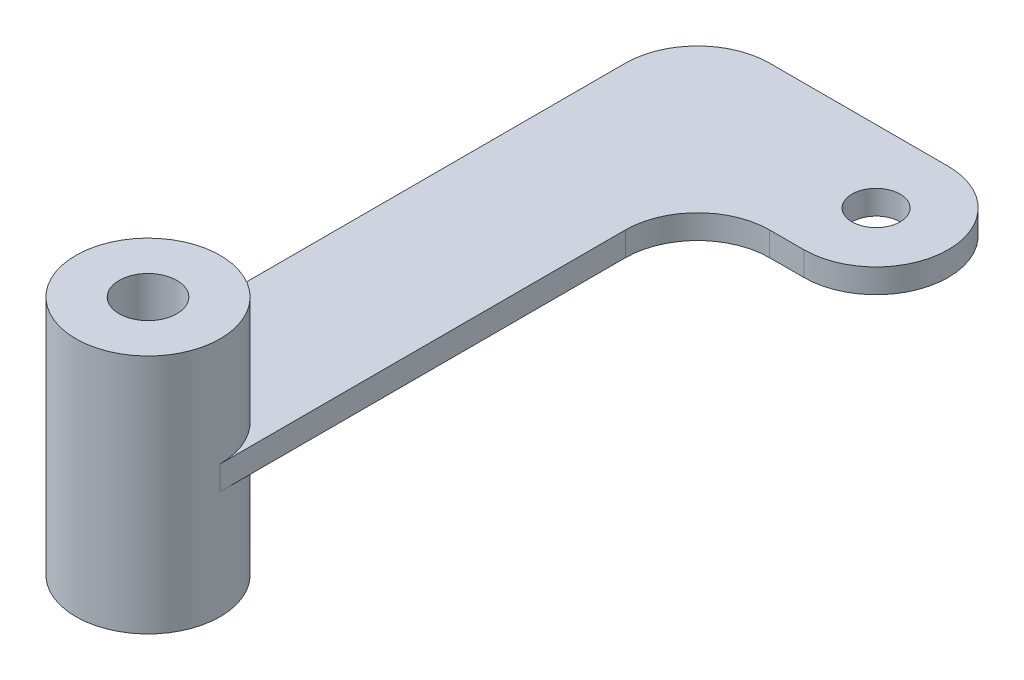
ISO-10303-21;
HEADER;
FILE_DESCRIPTION(('STEP AP214'),'2;1');
FILE_NAME('part.step','',(''),(''),'','','');
FILE_SCHEMA(('AUTOMOTIVE_DESIGN { 1 0 10303 214 1 1 1 1 }'));
ENDSEC;
DATA;
#1=APPLICATION_CONTEXT('core data for automotive mechanical design processes');
#2=APPLICATION_PROTOCOL_DEFINITION('international standard','automotive_design',2000,#1);
#3=PRODUCT_CONTEXT('',#1,'mechanical');
#4=PRODUCT('Part','Part','',(#3));
#5=PRODUCT_RELATED_PRODUCT_CATEGORY('part','',(#4));
#6=PRODUCT_DEFINITION_FORMATION('','',#4);
#7=PRODUCT_DEFINITION_CONTEXT('part definition',#1,'design');
#8=PRODUCT_DEFINITION('design','',#6,#7);
#9=PRODUCT_DEFINITION_SHAPE('','',#8);
#10=(LENGTH_UNIT() NAMED_UNIT(*) SI_UNIT(.MILLI.,.METRE.));
#11=(NAMED_UNIT(*) PLANE_ANGLE_UNIT() SI_UNIT($,.RADIAN.));
#12=(NAMED_UNIT(*) SI_UNIT($,.STERADIAN.) SOLID_ANGLE_UNIT());
#13=UNCERTAINTY_MEASURE_WITH_UNIT(LENGTH_MEASURE(1.E-05),#10,'distance_accuracy_value','');
#14=(GEOMETRIC_REPRESENTATION_CONTEXT(3) GLOBAL_UNCERTAINTY_ASSIGNED_CONTEXT((#13)) GLOBAL_UNIT_ASSIGNED_CONTEXT((#10,
#11,#12)) REPRESENTATION_CONTEXT('',''));
#15=CARTESIAN_POINT('',(0.,0.,0.));
#16=DIRECTION('',(0.,0.,1.));
#17=DIRECTION('',(1.,0.,0.));
#18=AXIS2_PLACEMENT_3D('',#15,#16,#17);
#19=CARTESIAN_POINT('',(6.,-5.,0.));
#20=DIRECTION('',(0.,1.,0.));
#21=DIRECTION('',(0.,0.,1.));
#22=AXIS2_PLACEMENT_3D('',#19,#20,#21);
#23=PLANE('',#22);
#24=CARTESIAN_POINT('',(0.,-5.,0.));
#25=DIRECTION('',(0.,1.,0.));
#26=DIRECTION('',(0.,0.,1.));
#27=AXIS2_PLACEMENT_3D('',#24,#25,#26);
#28=CIRCLE('',#27,5.99999999999999);
#29=CARTESIAN_POINT('',(0.,-5.,5.99999999999999));
#30=VERTEX_POINT('',#29);
#31=EDGE_CURVE('E162',#30,#30,#28,.T.);
#32=ORIENTED_EDGE('',*,*,#31,.F.);
#33=EDGE_LOOP('',(#32));
#34=FACE_BOUND('',#33,.T.);
#35=CARTESIAN_POINT('',(0.,-5.,0.));
#36=DIRECTION('',(0.,1.,0.));
#37=DIRECTION('',(0.,0.,1.));
#38=AXIS2_PLACEMENT_3D('',#35,#36,#37);
#39=CIRCLE('',#38,4.99999999999999);
#40=CARTESIAN_POINT('',(0.,-5.,4.99999999999999));
#41=VERTEX_POINT('',#40);
#42=EDGE_CURVE('E136',#41,#41,#39,.T.);
#43=ORIENTED_EDGE('',*,*,#42,.T.);
#44=EDGE_LOOP('',(#43));
#45=FACE_BOUND('',#44,.T.);
#46=ADVANCED_FACE('F41',(#34,#45),#23,.F.);
#47=CARTESIAN_POINT('',(0.,25.,0.));
#48=DIRECTION('',(0.,1.,0.));
#49=DIRECTION('',(0.,0.,1.));
#50=AXIS2_PLACEMENT_3D('',#47,#48,#49);
#51=CYLINDRICAL_SURFACE('',#50,5.99999999999999);
#52=CARTESIAN_POINT('',(0.,-25.,0.));
#53=DIRECTION('',(0.,1.,0.));
#54=DIRECTION('',(0.,0.,1.));
#55=AXIS2_PLACEMENT_3D('',#52,#53,#54);
#56=CIRCLE('',#55,5.99999999999999);
#57=CARTESIAN_POINT('',(0.,-25.,5.99999999999999));
#58=VERTEX_POINT('',#57);
#59=EDGE_CURVE('E159',#58,#58,#56,.T.);
#60=ORIENTED_EDGE('',*,*,#59,.F.);
#61=EDGE_LOOP('',(#60));
#62=FACE_BOUND('',#61,.T.);
#63=ORIENTED_EDGE('',*,*,#31,.T.);
#64=EDGE_LOOP('',(#63));
#65=FACE_BOUND('',#64,.T.);
#66=ADVANCED_FACE('F196',(#62,#65),#51,.F.);
#67=CARTESIAN_POINT('',(15.,-25.,0.));
#68=DIRECTION('',(0.,1.,0.));
#69=DIRECTION('',(0.,0.,1.));
#70=AXIS2_PLACEMENT_3D('',#67,#68,#69);
#71=PLANE('',#70);
#72=CARTESIAN_POINT('',(0.,-25.,0.));
#73=DIRECTION('',(0.,1.,0.));
#74=DIRECTION('',(0.,0.,1.));
#75=AXIS2_PLACEMENT_3D('',#72,#73,#74);
#76=CIRCLE('',#75,15.);
#77=CARTESIAN_POINT('',(0.,-25.,15.));
#78=VERTEX_POINT('',#77);
#79=EDGE_CURVE('E156',#78,#78,#76,.T.);
#80=ORIENTED_EDGE('',*,*,#79,.F.);
#81=EDGE_LOOP('',(#80));
#82=FACE_BOUND('',#81,.T.);
#83=ORIENTED_EDGE('',*,*,#59,.T.);
#84=EDGE_LOOP('',(#83));
#85=FACE_BOUND('',#84,.T.);
#86=ADVANCED_FACE('F202',(#82,#85),#71,.F.);
#87=CARTESIAN_POINT('',(0.,25.,0.));
#88=DIRECTION('',(0.,1.,0.));
#89=DIRECTION('',(0.,0.,1.));
#90=AXIS2_PLACEMENT_3D('',#87,#88,#89);
#91=CYLINDRICAL_SURFACE('',#90,15.);
#92=DIRECTION('',(0.,-1.,0.));
#93=VECTOR('',#92,1.);
#94=CARTESIAN_POINT('',(15.,2.5,0.));
#95=LINE('',#94,#93);
#96=CARTESIAN_POINT('',(15.,2.5,0.));
#97=VERTEX_POINT('',#96);
#98=CARTESIAN_POINT('',(15.,-2.5,0.));
#99=VERTEX_POINT('',#98);
#100=EDGE_CURVE('E186',#97,#99,#95,.T.);
#101=ORIENTED_EDGE('',*,*,#100,.F.);
#102=CARTESIAN_POINT('',(0.,2.5,0.));
#103=DIRECTION('',(0.,1.,0.));
#104=DIRECTION('',(0.,0.,1.));
#105=AXIS2_PLACEMENT_3D('',#102,#103,#104);
#106=CIRCLE('',#105,15.);
#107=CARTESIAN_POINT('',(-8.29156197588848,2.5,-12.5));
#108=VERTEX_POINT('',#107);
#109=EDGE_CURVE('E399',#97,#108,#106,.T.);
#110=ORIENTED_EDGE('',*,*,#109,.T.);
#111=DIRECTION('',(0.,-1.,0.));
#112=VECTOR('',#111,1.);
#113=CARTESIAN_POINT('',(-8.29156197588848,2.5,-12.5));
#114=LINE('',#113,#112);
#115=CARTESIAN_POINT('',(-8.29156197588848,-2.5,-12.5));
#116=VERTEX_POINT('',#115);
#117=EDGE_CURVE('E376',#108,#116,#114,.T.);
#118=ORIENTED_EDGE('',*,*,#117,.T.);
#119=CARTESIAN_POINT('',(0.,-2.5,0.));
#120=DIRECTION('',(0.,1.,0.));
#121=DIRECTION('',(0.,0.,1.));
#122=AXIS2_PLACEMENT_3D('',#119,#120,#121);
#123=CIRCLE('',#122,15.);
#124=EDGE_CURVE('E187',#99,#116,#123,.T.);
#125=ORIENTED_EDGE('',*,*,#124,.F.);
#126=EDGE_LOOP('',(#101,#110,#118,#125));
#127=FACE_BOUND('',#126,.T.);
#128=CARTESIAN_POINT('',(0.,25.,0.));
#129=DIRECTION('',(0.,1.,0.));
#130=DIRECTION('',(0.,0.,1.));
#131=AXIS2_PLACEMENT_3D('',#128,#129,#130);
#132=CIRCLE('',#131,15.);
#133=CARTESIAN_POINT('',(0.,25.,15.));
#134=VERTEX_POINT('',#133);
#135=EDGE_CURVE('E153',#134,#134,#132,.T.);
#136=ORIENTED_EDGE('',*,*,#135,.F.);
#137=EDGE_LOOP('',(#136));
#138=FACE_BOUND('',#137,.T.);
#139=ORIENTED_EDGE('',*,*,#79,.T.);
#140=EDGE_LOOP('',(#139));
#141=FACE_BOUND('',#140,.T.);
#142=ADVANCED_FACE('F210',(#127,#138,#141),#91,.T.);
#143=CARTESIAN_POINT('',(5.99999999999999,25.,0.));
#144=DIRECTION('',(0.,-1.,0.));
#145=DIRECTION('',(0.,0.,-1.));
#146=AXIS2_PLACEMENT_3D('',#143,#144,#145);
#147=PLANE('',#146);
#148=CARTESIAN_POINT('',(0.,25.,0.));
#149=DIRECTION('',(0.,1.,0.));
#150=DIRECTION('',(0.,0.,1.));
#151=AXIS2_PLACEMENT_3D('',#148,#149,#150);
#152=CIRCLE('',#151,5.99999999999998);
#153=CARTESIAN_POINT('',(0.,25.,5.99999999999998));
#154=VERTEX_POINT('',#153);
#155=EDGE_CURVE('E150',#154,#154,#152,.T.);
#156=ORIENTED_EDGE('',*,*,#155,.F.);
#157=EDGE_LOOP('',(#156));
#158=FACE_BOUND('',#157,.T.);
#159=ORIENTED_EDGE('',*,*,#135,.T.);
#160=EDGE_LOOP('',(#159));
#161=FACE_BOUND('',#160,.T.);
#162=ADVANCED_FACE('F214',(#158,#161),#147,.F.);
#163=CARTESIAN_POINT('',(0.,25.,0.));
#164=DIRECTION('',(0.,1.,0.));
#165=DIRECTION('',(0.,0.,1.));
#166=AXIS2_PLACEMENT_3D('',#163,#164,#165);
#167=CYLINDRICAL_SURFACE('',#166,5.99999999999998);
#168=CARTESIAN_POINT('',(0.,5.,0.));
#169=DIRECTION('',(0.,1.,0.));
#170=DIRECTION('',(0.,0.,1.));
#171=AXIS2_PLACEMENT_3D('',#168,#169,#170);
#172=CIRCLE('',#171,5.99999999999999);
#173=CARTESIAN_POINT('',(0.,5.,5.99999999999999));
#174=VERTEX_POINT('',#173);
#175=EDGE_CURVE('E147',#174,#174,#172,.T.);
#176=ORIENTED_EDGE('',*,*,#175,.F.);
#177=EDGE_LOOP('',(#176));
#178=FACE_BOUND('',#177,.T.);
#179=ORIENTED_EDGE('',*,*,#155,.T.);
#180=EDGE_LOOP('',(#179));
#181=FACE_BOUND('',#180,.T.);
#182=ADVANCED_FACE('F218',(#178,#181),#167,.F.);
#183=CARTESIAN_POINT('',(5.,5.,0.));
#184=DIRECTION('',(0.,-1.,0.));
#185=DIRECTION('',(0.,0.,-1.));
#186=AXIS2_PLACEMENT_3D('',#183,#184,#185);
#187=PLANE('',#186);
#188=CARTESIAN_POINT('',(0.,5.,0.));
#189=DIRECTION('',(0.,1.,0.));
#190=DIRECTION('',(0.,0.,1.));
#191=AXIS2_PLACEMENT_3D('',#188,#189,#190);
#192=CIRCLE('',#191,4.99999999999999);
#193=CARTESIAN_POINT('',(0.,5.,4.99999999999999));
#194=VERTEX_POINT('',#193);
#195=EDGE_CURVE('E139',#194,#194,#192,.T.);
#196=ORIENTED_EDGE('',*,*,#195,.F.);
#197=EDGE_LOOP('',(#196));
#198=FACE_BOUND('',#197,.T.);
#199=ORIENTED_EDGE('',*,*,#175,.T.);
#200=EDGE_LOOP('',(#199));
#201=FACE_BOUND('',#200,.T.);
#202=ADVANCED_FACE('F222',(#198,#201),#187,.F.);
#203=CARTESIAN_POINT('',(0.,25.,0.));
#204=DIRECTION('',(0.,1.,0.));
#205=DIRECTION('',(0.,0.,1.));
#206=AXIS2_PLACEMENT_3D('',#203,#204,#205);
#207=CYLINDRICAL_SURFACE('',#206,4.99999999999999);
#208=ORIENTED_EDGE('',*,*,#42,.F.);
#209=EDGE_LOOP('',(#208));
#210=FACE_BOUND('',#209,.T.);
#211=ORIENTED_EDGE('',*,*,#195,.T.);
#212=EDGE_LOOP('',(#211));
#213=FACE_BOUND('',#212,.T.);
#214=ADVANCED_FACE('F226',(#210,#213),#207,.F.);
#215=CARTESIAN_POINT('',(0.,2.5,-99.1267819554185));
#216=DIRECTION('',(0.,0.,-1.));
#217=DIRECTION('',(-1.,0.,0.));
#218=AXIS2_PLACEMENT_3D('',#215,#216,#217);
#219=PLANE('',#218);
#220=DIRECTION('',(1.,0.,0.));
#221=VECTOR('',#220,1.);
#222=CARTESIAN_POINT('',(0.,2.5,-99.1267819554185));
#223=LINE('',#222,#221);
#224=CARTESIAN_POINT('',(30.,2.5,-99.1267819554185));
#225=VERTEX_POINT('',#224);
#226=CARTESIAN_POINT('',(37.0820393249934,2.5,-99.1267819554185));
#227=VERTEX_POINT('',#226);
#228=EDGE_CURVE('E110',#225,#227,#223,.T.);
#229=ORIENTED_EDGE('',*,*,#228,.F.);
#230=DIRECTION('',(0.,-1.,0.));
#231=VECTOR('',#230,1.);
#232=CARTESIAN_POINT('',(30.,-2.5,-99.1267819554185));
#233=LINE('',#232,#231);
#234=CARTESIAN_POINT('',(30.,-2.5,-99.1267819554185));
#235=VERTEX_POINT('',#234);
#236=EDGE_CURVE('E174',#225,#235,#233,.T.);
#237=ORIENTED_EDGE('',*,*,#236,.T.);
#238=DIRECTION('',(1.,0.,0.));
#239=VECTOR('',#238,1.);
#240=CARTESIAN_POINT('',(0.,-2.5,-99.1267819554185));
#241=LINE('',#240,#239);
#242=CARTESIAN_POINT('',(37.0820393249934,-2.5,-99.1267819554185));
#243=VERTEX_POINT('',#242);
#244=EDGE_CURVE('E134',#235,#243,#241,.T.);
#245=ORIENTED_EDGE('',*,*,#244,.T.);
#246=DIRECTION('',(0.,-1.,0.));
#247=VECTOR('',#246,1.);
#248=CARTESIAN_POINT('',(37.0820393249934,2.5,-99.1267819554185));
#249=LINE('',#248,#247);
#250=EDGE_CURVE('E127',#227,#243,#249,.T.);
#251=ORIENTED_EDGE('',*,*,#250,.F.);
#252=EDGE_LOOP('',(#229,#237,#245,#251));
#253=FACE_BOUND('',#252,.T.);
#254=ADVANCED_FACE('F132',(#253),#219,.F.);
#255=CARTESIAN_POINT('',(37.0820393249934,2.5,-114.126781955419));
#256=DIRECTION('',(0.,-1.,0.));
#257=DIRECTION('',(0.,0.,-1.));
#258=AXIS2_PLACEMENT_3D('',#255,#256,#257);
#259=CYLINDRICAL_SURFACE('',#258,15.);
#260=CARTESIAN_POINT('',(37.0820393249934,-2.5,-114.126781955419));
#261=DIRECTION('',(0.,1.,0.));
#262=DIRECTION('',(0.,0.,1.));
#263=AXIS2_PLACEMENT_3D('',#260,#261,#262);
#264=CIRCLE('',#263,15.);
#265=CARTESIAN_POINT('',(37.0820393249934,-2.5,-129.126781955419));
#266=VERTEX_POINT('',#265);
#267=EDGE_CURVE('E393',#243,#266,#264,.T.);
#268=ORIENTED_EDGE('',*,*,#267,.T.);
#269=DIRECTION('',(0.,-1.,0.));
#270=VECTOR('',#269,1.);
#271=CARTESIAN_POINT('',(37.0820393249934,2.5,-129.126781955419));
#272=LINE('',#271,#270);
#273=CARTESIAN_POINT('',(37.0820393249934,2.5,-129.126781955419));
#274=VERTEX_POINT('',#273);
#275=EDGE_CURVE('E129',#274,#266,#272,.T.);
#276=ORIENTED_EDGE('',*,*,#275,.F.);
#277=CARTESIAN_POINT('',(37.0820393249934,2.5,-114.126781955419));
#278=DIRECTION('',(0.,1.,0.));
#279=DIRECTION('',(0.,0.,1.));
#280=AXIS2_PLACEMENT_3D('',#277,#278,#279);
#281=CIRCLE('',#280,15.);
#282=EDGE_CURVE('E115',#227,#274,#281,.T.);
#283=ORIENTED_EDGE('',*,*,#282,.F.);
#284=ORIENTED_EDGE('',*,*,#250,.T.);
#285=EDGE_LOOP('',(#268,#276,#283,#284));
#286=FACE_BOUND('',#285,.T.);
#287=ADVANCED_FACE('F126',(#286),#259,.T.);
#288=CARTESIAN_POINT('',(0.,2.5,-129.126781955419));
#289=DIRECTION('',(0.,0.,-1.));
#290=DIRECTION('',(-1.,0.,0.));
#291=AXIS2_PLACEMENT_3D('',#288,#289,#290);
#292=PLANE('',#291);
#293=DIRECTION('',(1.,0.,0.));
#294=VECTOR('',#293,1.);
#295=CARTESIAN_POINT('',(0.,-2.5,-129.126781955419));
#296=LINE('',#295,#294);
#297=CARTESIAN_POINT('',(0.,-2.5,-129.126781955419));
#298=VERTEX_POINT('',#297);
#299=EDGE_CURVE('E389',#298,#266,#296,.T.);
#300=ORIENTED_EDGE('',*,*,#299,.F.);
#301=DIRECTION('',(0.,-1.,0.));
#302=VECTOR('',#301,1.);
#303=CARTESIAN_POINT('',(0.,2.5,-129.126781955419));
#304=LINE('',#303,#302);
#305=CARTESIAN_POINT('',(0.,2.5,-129.126781955419));
#306=VERTEX_POINT('',#305);
#307=EDGE_CURVE('E170',#298,#306,#304,.F.);
#308=ORIENTED_EDGE('',*,*,#307,.T.);
#309=DIRECTION('',(1.,0.,0.));
#310=VECTOR('',#309,1.);
#311=CARTESIAN_POINT('',(0.,2.5,-129.126781955419));
#312=LINE('',#311,#310);
#313=EDGE_CURVE('E130',#306,#274,#312,.T.);
#314=ORIENTED_EDGE('',*,*,#313,.T.);
#315=ORIENTED_EDGE('',*,*,#275,.T.);
#316=EDGE_LOOP('',(#300,#308,#314,#315));
#317=FACE_BOUND('',#316,.T.);
#318=ADVANCED_FACE('F235',(#317),#292,.T.);
#319=CARTESIAN_POINT('',(-15.,2.5,0.));
#320=DIRECTION('',(1.,0.,0.));
#321=DIRECTION('',(0.,0.,-1.));
#322=AXIS2_PLACEMENT_3D('',#319,#320,#321);
#323=PLANE('',#322);
#324=DIRECTION('',(0.,0.,1.));
#325=VECTOR('',#324,1.);
#326=CARTESIAN_POINT('',(-15.,2.5,0.));
#327=LINE('',#326,#325);
#328=CARTESIAN_POINT('',(-15.,2.5,-114.126781955419));
#329=VERTEX_POINT('',#328);
#330=CARTESIAN_POINT('',(-15.,2.5,-12.5));
#331=VERTEX_POINT('',#330);
#332=EDGE_CURVE('E402',#329,#331,#327,.T.);
#333=ORIENTED_EDGE('',*,*,#332,.F.);
#334=DIRECTION('',(0.,-1.,0.));
#335=VECTOR('',#334,1.);
#336=CARTESIAN_POINT('',(-15.,-2.5,-114.126781955419));
#337=LINE('',#336,#335);
#338=CARTESIAN_POINT('',(-15.,-2.5,-114.126781955419));
#339=VERTEX_POINT('',#338);
#340=EDGE_CURVE('E165',#329,#339,#337,.T.);
#341=ORIENTED_EDGE('',*,*,#340,.T.);
#342=DIRECTION('',(0.,0.,1.));
#343=VECTOR('',#342,1.);
#344=CARTESIAN_POINT('',(-15.,-2.5,0.));
#345=LINE('',#344,#343);
#346=CARTESIAN_POINT('',(-15.,-2.5,-12.5));
#347=VERTEX_POINT('',#346);
#348=EDGE_CURVE('E387',#339,#347,#345,.T.);
#349=ORIENTED_EDGE('',*,*,#348,.T.);
#350=DIRECTION('',(0.,-1.,0.));
#351=VECTOR('',#350,1.);
#352=CARTESIAN_POINT('',(-15.,2.5,-12.5));
#353=LINE('',#352,#351);
#354=EDGE_CURVE('E141',#331,#347,#353,.T.);
#355=ORIENTED_EDGE('',*,*,#354,.F.);
#356=EDGE_LOOP('',(#333,#341,#349,#355));
#357=FACE_BOUND('',#356,.T.);
#358=ADVANCED_FACE('F238',(#357),#323,.F.);
#359=CARTESIAN_POINT('',(0.,2.5,-12.5));
#360=DIRECTION('',(0.,0.,-1.));
#361=DIRECTION('',(-1.,0.,0.));
#362=AXIS2_PLACEMENT_3D('',#359,#360,#361);
#363=PLANE('',#362);
#364=DIRECTION('',(1.,0.,0.));
#365=VECTOR('',#364,1.);
#366=CARTESIAN_POINT('',(0.,-2.5,-12.5));
#367=LINE('',#366,#365);
#368=EDGE_CURVE('E383',#347,#116,#367,.T.);
#369=ORIENTED_EDGE('',*,*,#368,.T.);
#370=ORIENTED_EDGE('',*,*,#117,.F.);
#371=DIRECTION('',(1.,0.,0.));
#372=VECTOR('',#371,1.);
#373=CARTESIAN_POINT('',(0.,2.5,-12.5));
#374=LINE('',#373,#372);
#375=EDGE_CURVE('E385',#331,#108,#374,.T.);
#376=ORIENTED_EDGE('',*,*,#375,.F.);
#377=ORIENTED_EDGE('',*,*,#354,.T.);
#378=EDGE_LOOP('',(#369,#370,#376,#377));
#379=FACE_BOUND('',#378,.T.);
#380=ADVANCED_FACE('F242',(#379),#363,.F.);
#381=CARTESIAN_POINT('',(15.,2.5,0.));
#382=DIRECTION('',(-1.,0.,0.));
#383=DIRECTION('',(0.,0.,1.));
#384=AXIS2_PLACEMENT_3D('',#381,#382,#383);
#385=PLANE('',#384);
#386=DIRECTION('',(0.,0.,-1.));
#387=VECTOR('',#386,1.);
#388=CARTESIAN_POINT('',(15.,-2.5,0.));
#389=LINE('',#388,#387);
#390=CARTESIAN_POINT('',(15.,-2.5,-84.1267819554185));
#391=VERTEX_POINT('',#390);
#392=EDGE_CURVE('E182',#99,#391,#389,.T.);
#393=ORIENTED_EDGE('',*,*,#392,.T.);
#394=DIRECTION('',(0.,-1.,0.));
#395=VECTOR('',#394,1.);
#396=CARTESIAN_POINT('',(15.,2.5,-84.1267819554185));
#397=LINE('',#396,#395);
#398=CARTESIAN_POINT('',(15.,2.5,-84.1267819554185));
#399=VERTEX_POINT('',#398);
#400=EDGE_CURVE('E56',#391,#399,#397,.F.);
#401=ORIENTED_EDGE('',*,*,#400,.T.);
#402=DIRECTION('',(0.,0.,-1.));
#403=VECTOR('',#402,1.);
#404=CARTESIAN_POINT('',(15.,2.5,0.));
#405=LINE('',#404,#403);
#406=EDGE_CURVE('E397',#97,#399,#405,.T.);
#407=ORIENTED_EDGE('',*,*,#406,.F.);
#408=ORIENTED_EDGE('',*,*,#100,.T.);
#409=EDGE_LOOP('',(#393,#401,#407,#408));
#410=FACE_BOUND('',#409,.T.);
#411=ADVANCED_FACE('F185',(#410),#385,.F.);
#412=CARTESIAN_POINT('',(37.0820393249934,2.5,-114.126781955419));
#413=DIRECTION('',(0.,-1.,0.));
#414=DIRECTION('',(0.,0.,-1.));
#415=AXIS2_PLACEMENT_3D('',#412,#413,#414);
#416=CYLINDRICAL_SURFACE('',#415,5.);
#417=CARTESIAN_POINT('',(37.0820393249934,2.5,-114.126781955419));
#418=DIRECTION('',(0.,1.,0.));
#419=DIRECTION('',(0.,0.,1.));
#420=AXIS2_PLACEMENT_3D('',#417,#418,#419);
#421=CIRCLE('',#420,5.);
#422=CARTESIAN_POINT('',(37.0820393249934,2.5,-109.126781955419));
#423=VERTEX_POINT('',#422);
#424=EDGE_CURVE('E369',#423,#423,#421,.T.);
#425=ORIENTED_EDGE('',*,*,#424,.T.);
#426=EDGE_LOOP('',(#425));
#427=FACE_BOUND('',#426,.T.);
#428=CARTESIAN_POINT('',(37.0820393249934,-2.5,-114.126781955419));
#429=DIRECTION('',(0.,1.,0.));
#430=DIRECTION('',(0.,0.,1.));
#431=AXIS2_PLACEMENT_3D('',#428,#429,#430);
#432=CIRCLE('',#431,5.);
#433=CARTESIAN_POINT('',(37.0820393249934,-2.5,-109.126781955419));
#434=VERTEX_POINT('',#433);
#435=EDGE_CURVE('E121',#434,#434,#432,.T.);
#436=ORIENTED_EDGE('',*,*,#435,.F.);
#437=EDGE_LOOP('',(#436));
#438=FACE_BOUND('',#437,.T.);
#439=ADVANCED_FACE('F249',(#427,#438),#416,.F.);
#440=CARTESIAN_POINT('',(0.,2.5,0.));
#441=DIRECTION('',(0.,1.,0.));
#442=DIRECTION('',(0.,0.,1.));
#443=AXIS2_PLACEMENT_3D('',#440,#441,#442);
#444=PLANE('',#443);
#445=ORIENTED_EDGE('',*,*,#313,.F.);
#446=CARTESIAN_POINT('',(0.,2.5,-114.126781955419));
#447=DIRECTION('',(0.,1.,0.));
#448=DIRECTION('',(0.,0.,1.));
#449=AXIS2_PLACEMENT_3D('',#446,#447,#448);
#450=CIRCLE('',#449,15.);
#451=EDGE_CURVE('E172',#306,#329,#450,.T.);
#452=ORIENTED_EDGE('',*,*,#451,.T.);
#453=ORIENTED_EDGE('',*,*,#332,.T.);
#454=ORIENTED_EDGE('',*,*,#375,.T.);
#455=ORIENTED_EDGE('',*,*,#109,.F.);
#456=ORIENTED_EDGE('',*,*,#406,.T.);
#457=CARTESIAN_POINT('',(30.,2.5,-84.1267819554185));
#458=DIRECTION('',(0.,1.,0.));
#459=DIRECTION('',(0.,0.,1.));
#460=AXIS2_PLACEMENT_3D('',#457,#458,#459);
#461=CIRCLE('',#460,15.);
#462=EDGE_CURVE('E11',#399,#225,#461,.F.);
#463=ORIENTED_EDGE('',*,*,#462,.T.);
#464=ORIENTED_EDGE('',*,*,#228,.T.);
#465=ORIENTED_EDGE('',*,*,#282,.T.);
#466=EDGE_LOOP('',(#445,#452,#453,#454,#455,#456,#463,#464,#465));
#467=FACE_BOUND('',#466,.T.);
#468=ORIENTED_EDGE('',*,*,#424,.F.);
#469=EDGE_LOOP('',(#468));
#470=FACE_BOUND('',#469,.T.);
#471=ADVANCED_FACE('F113',(#467,#470),#444,.T.);
#472=CARTESIAN_POINT('',(0.,-2.5,0.));
#473=DIRECTION('',(0.,1.,0.));
#474=DIRECTION('',(0.,0.,1.));
#475=AXIS2_PLACEMENT_3D('',#472,#473,#474);
#476=PLANE('',#475);
#477=ORIENTED_EDGE('',*,*,#348,.F.);
#478=CARTESIAN_POINT('',(0.,-2.5,-114.126781955419));
#479=DIRECTION('',(0.,1.,0.));
#480=DIRECTION('',(0.,0.,1.));
#481=AXIS2_PLACEMENT_3D('',#478,#479,#480);
#482=CIRCLE('',#481,15.);
#483=EDGE_CURVE('E168',#339,#298,#482,.F.);
#484=ORIENTED_EDGE('',*,*,#483,.T.);
#485=ORIENTED_EDGE('',*,*,#299,.T.);
#486=ORIENTED_EDGE('',*,*,#267,.F.);
#487=ORIENTED_EDGE('',*,*,#244,.F.);
#488=CARTESIAN_POINT('',(30.,-2.5,-84.1267819554185));
#489=DIRECTION('',(0.,1.,0.));
#490=DIRECTION('',(0.,0.,1.));
#491=AXIS2_PLACEMENT_3D('',#488,#489,#490);
#492=CIRCLE('',#491,15.);
#493=EDGE_CURVE('E49',#235,#391,#492,.T.);
#494=ORIENTED_EDGE('',*,*,#493,.T.);
#495=ORIENTED_EDGE('',*,*,#392,.F.);
#496=ORIENTED_EDGE('',*,*,#124,.T.);
#497=ORIENTED_EDGE('',*,*,#368,.F.);
#498=EDGE_LOOP('',(#477,#484,#485,#486,#487,#494,#495,#496,#497));
#499=FACE_BOUND('',#498,.T.);
#500=ORIENTED_EDGE('',*,*,#435,.T.);
#501=EDGE_LOOP('',(#500));
#502=FACE_BOUND('',#501,.T.);
#503=ADVANCED_FACE('F179',(#499,#502),#476,.F.);
#504=CARTESIAN_POINT('',(0.,2.5,-114.126781955419));
#505=DIRECTION('',(0.,1.,0.));
#506=DIRECTION('',(0.,0.,1.));
#507=AXIS2_PLACEMENT_3D('',#504,#505,#506);
#508=CYLINDRICAL_SURFACE('',#507,15.);
#509=ORIENTED_EDGE('',*,*,#451,.F.);
#510=ORIENTED_EDGE('',*,*,#307,.F.);
#511=ORIENTED_EDGE('',*,*,#483,.F.);
#512=ORIENTED_EDGE('',*,*,#340,.F.);
#513=EDGE_LOOP('',(#509,#510,#511,#512));
#514=FACE_BOUND('',#513,.T.);
#515=ADVANCED_FACE('F190',(#514),#508,.T.);
#516=CARTESIAN_POINT('',(30.,2.5,-84.1267819554185));
#517=DIRECTION('',(0.,1.,0.));
#518=DIRECTION('',(0.,0.,1.));
#519=AXIS2_PLACEMENT_3D('',#516,#517,#518);
#520=CYLINDRICAL_SURFACE('',#519,15.);
#521=ORIENTED_EDGE('',*,*,#462,.F.);
#522=ORIENTED_EDGE('',*,*,#400,.F.);
#523=ORIENTED_EDGE('',*,*,#493,.F.);
#524=ORIENTED_EDGE('',*,*,#236,.F.);
#525=EDGE_LOOP('',(#521,#522,#523,#524));
#526=FACE_BOUND('',#525,.T.);
#527=ADVANCED_FACE('F43',(#526),#520,.F.);
#528=CLOSED_SHELL('',(#46,#66,#86,#142,#162,#182,#202,#214,#254,#287,#318,#358,#380,#411,#439,
#471,#503,#515,#527));
#529=MANIFOLD_SOLID_BREP('B2',#528);
#530=ADVANCED_BREP_SHAPE_REPRESENTATION('',(#18,#529),#14);
#531=SHAPE_DEFINITION_REPRESENTATION(#9,#530);
ENDSEC;
END-ISO-10303-21;
